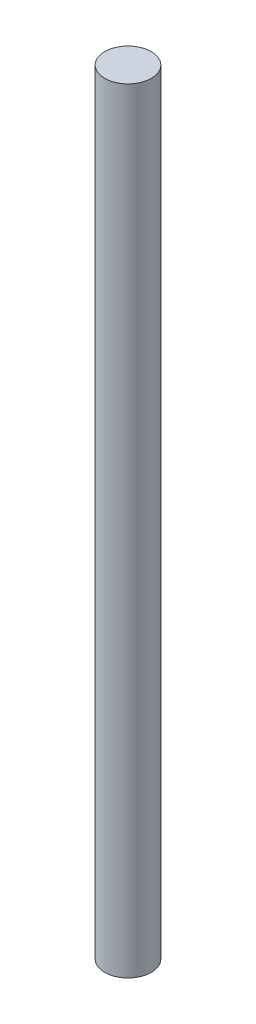
ISO-10303-21;
HEADER;
FILE_DESCRIPTION(('STEP AP214'),'2;1');
FILE_NAME('part.step','',(''),(''),'','','');
FILE_SCHEMA(('AUTOMOTIVE_DESIGN { 1 0 10303 214 1 1 1 1 }'));
ENDSEC;
DATA;
#1=APPLICATION_CONTEXT('core data for automotive mechanical design processes');
#2=APPLICATION_PROTOCOL_DEFINITION('international standard','automotive_design',2000,#1);
#3=PRODUCT_CONTEXT('',#1,'mechanical');
#4=PRODUCT('Part','Part','',(#3));
#5=PRODUCT_RELATED_PRODUCT_CATEGORY('part','',(#4));
#6=PRODUCT_DEFINITION_FORMATION('','',#4);
#7=PRODUCT_DEFINITION_CONTEXT('part definition',#1,'design');
#8=PRODUCT_DEFINITION('design','',#6,#7);
#9=PRODUCT_DEFINITION_SHAPE('','',#8);
#10=(LENGTH_UNIT() NAMED_UNIT(*) SI_UNIT(.MILLI.,.METRE.));
#11=(NAMED_UNIT(*) PLANE_ANGLE_UNIT() SI_UNIT($,.RADIAN.));
#12=(NAMED_UNIT(*) SI_UNIT($,.STERADIAN.) SOLID_ANGLE_UNIT());
#13=UNCERTAINTY_MEASURE_WITH_UNIT(LENGTH_MEASURE(1.E-05),#10,'distance_accuracy_value','');
#14=(GEOMETRIC_REPRESENTATION_CONTEXT(3) GLOBAL_UNCERTAINTY_ASSIGNED_CONTEXT((#13)) GLOBAL_UNIT_ASSIGNED_CONTEXT((#10,
#11,#12)) REPRESENTATION_CONTEXT('',''));
#15=CARTESIAN_POINT('',(0.,0.,0.));
#16=DIRECTION('',(0.,0.,1.));
#17=DIRECTION('',(1.,0.,0.));
#18=AXIS2_PLACEMENT_3D('',#15,#16,#17);
#19=CARTESIAN_POINT('',(0.,250.,0.));
#20=DIRECTION('',(0.,-1.,0.));
#21=DIRECTION('',(0.,0.,-1.));
#22=AXIS2_PLACEMENT_3D('',#19,#20,#21);
#23=CYLINDRICAL_SURFACE('',#22,7.5);
#24=CARTESIAN_POINT('',(0.,250.,0.));
#25=DIRECTION('',(0.,1.,0.));
#26=DIRECTION('',(0.,0.,1.));
#27=AXIS2_PLACEMENT_3D('',#24,#25,#26);
#28=CIRCLE('',#27,7.5);
#29=CARTESIAN_POINT('',(0.,250.,7.5));
#30=VERTEX_POINT('',#29);
#31=EDGE_CURVE('E10',#30,#30,#28,.T.);
#32=ORIENTED_EDGE('',*,*,#31,.F.);
#33=EDGE_LOOP('',(#32));
#34=FACE_BOUND('',#33,.T.);
#35=CARTESIAN_POINT('',(0.,0.,0.));
#36=DIRECTION('',(0.,1.,0.));
#37=DIRECTION('',(0.,0.,1.));
#38=AXIS2_PLACEMENT_3D('',#35,#36,#37);
#39=CIRCLE('',#38,7.5);
#40=CARTESIAN_POINT('',(0.,0.,7.5));
#41=VERTEX_POINT('',#40);
#42=EDGE_CURVE('E37',#41,#41,#39,.T.);
#43=ORIENTED_EDGE('',*,*,#42,.T.);
#44=EDGE_LOOP('',(#43));
#45=FACE_BOUND('',#44,.T.);
#46=ADVANCED_FACE('F40',(#34,#45),#23,.T.);
#47=CARTESIAN_POINT('',(0.,250.,0.));
#48=DIRECTION('',(0.,1.,0.));
#49=DIRECTION('',(0.,0.,1.));
#50=AXIS2_PLACEMENT_3D('',#47,#48,#49);
#51=PLANE('',#50);
#52=ORIENTED_EDGE('',*,*,#31,.T.);
#53=EDGE_LOOP('',(#52));
#54=FACE_BOUND('',#53,.T.);
#55=ADVANCED_FACE('F55',(#54),#51,.T.);
#56=CARTESIAN_POINT('',(0.,0.,0.));
#57=DIRECTION('',(0.,1.,0.));
#58=DIRECTION('',(0.,0.,1.));
#59=AXIS2_PLACEMENT_3D('',#56,#57,#58);
#60=PLANE('',#59);
#61=ORIENTED_EDGE('',*,*,#42,.F.);
#62=EDGE_LOOP('',(#61));
#63=FACE_BOUND('',#62,.T.);
#64=ADVANCED_FACE('F49',(#63),#60,.F.);
#65=CLOSED_SHELL('',(#46,#55,#64));
#66=MANIFOLD_SOLID_BREP('B2',#65);
#67=ADVANCED_BREP_SHAPE_REPRESENTATION('',(#18,#66),#14);
#68=SHAPE_DEFINITION_REPRESENTATION(#9,#67);
ENDSEC;
END-ISO-10303-21;
